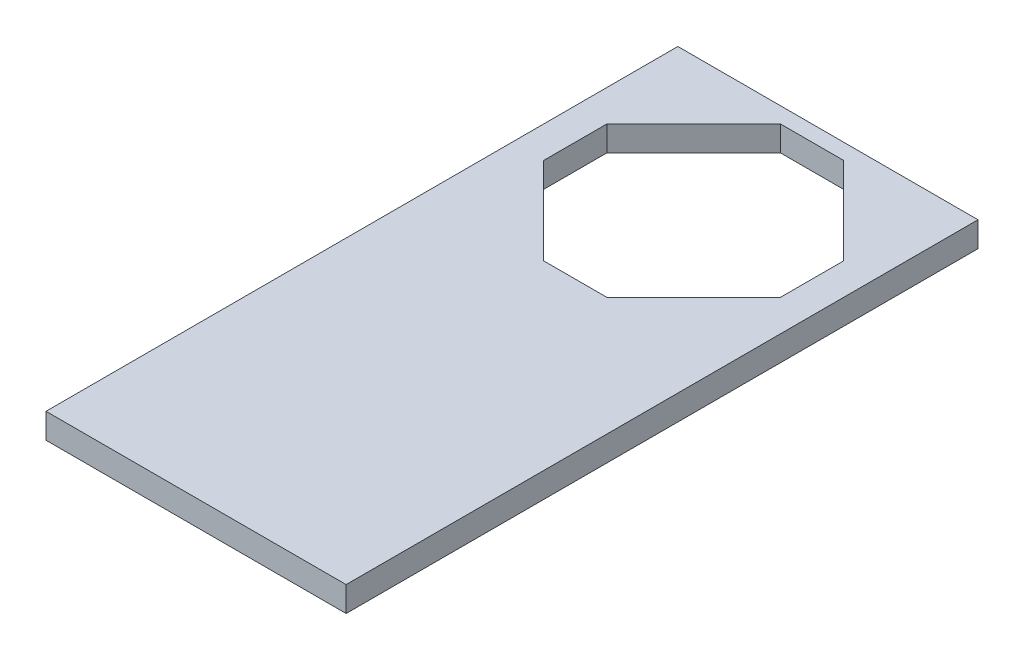
ISO-10303-21;
HEADER;
FILE_DESCRIPTION(('STEP AP214'),'2;1');
FILE_NAME('part.step','',(''),(''),'','','');
FILE_SCHEMA(('AUTOMOTIVE_DESIGN { 1 0 10303 214 1 1 1 1 }'));
ENDSEC;
DATA;
#1=APPLICATION_CONTEXT('core data for automotive mechanical design processes');
#2=APPLICATION_PROTOCOL_DEFINITION('international standard','automotive_design',2000,#1);
#3=PRODUCT_CONTEXT('',#1,'mechanical');
#4=PRODUCT('Part','Part','',(#3));
#5=PRODUCT_RELATED_PRODUCT_CATEGORY('part','',(#4));
#6=PRODUCT_DEFINITION_FORMATION('','',#4);
#7=PRODUCT_DEFINITION_CONTEXT('part definition',#1,'design');
#8=PRODUCT_DEFINITION('design','',#6,#7);
#9=PRODUCT_DEFINITION_SHAPE('','',#8);
#10=(LENGTH_UNIT() NAMED_UNIT(*) SI_UNIT(.MILLI.,.METRE.));
#11=(NAMED_UNIT(*) PLANE_ANGLE_UNIT() SI_UNIT($,.RADIAN.));
#12=(NAMED_UNIT(*) SI_UNIT($,.STERADIAN.) SOLID_ANGLE_UNIT());
#13=UNCERTAINTY_MEASURE_WITH_UNIT(LENGTH_MEASURE(1.E-05),#10,'distance_accuracy_value','');
#14=(GEOMETRIC_REPRESENTATION_CONTEXT(3) GLOBAL_UNCERTAINTY_ASSIGNED_CONTEXT((#13)) GLOBAL_UNIT_ASSIGNED_CONTEXT((#10,
#11,#12)) REPRESENTATION_CONTEXT('',''));
#15=CARTESIAN_POINT('',(0.,0.,0.));
#16=DIRECTION('',(0.,0.,1.));
#17=DIRECTION('',(1.,0.,0.));
#18=AXIS2_PLACEMENT_3D('',#15,#16,#17);
#19=CARTESIAN_POINT('',(0.,0.,40.));
#20=DIRECTION('',(-1.,0.,0.));
#21=DIRECTION('',(0.,0.,1.));
#22=AXIS2_PLACEMENT_3D('',#19,#20,#21);
#23=PLANE('',#22);
#24=DIRECTION('',(0.,1.,0.));
#25=VECTOR('',#24,1.);
#26=CARTESIAN_POINT('',(0.,0.,0.));
#27=LINE('',#26,#25);
#28=CARTESIAN_POINT('',(0.,0.,0.));
#29=VERTEX_POINT('',#28);
#30=CARTESIAN_POINT('',(0.,1.5875,0.));
#31=VERTEX_POINT('',#30);
#32=EDGE_CURVE('E179',#29,#31,#27,.T.);
#33=ORIENTED_EDGE('',*,*,#32,.F.);
#34=DIRECTION('',(0.,0.,-1.));
#35=VECTOR('',#34,1.);
#36=CARTESIAN_POINT('',(0.,0.,40.));
#37=LINE('',#36,#35);
#38=CARTESIAN_POINT('',(0.,0.,40.));
#39=VERTEX_POINT('',#38);
#40=EDGE_CURVE('E11',#39,#29,#37,.T.);
#41=ORIENTED_EDGE('',*,*,#40,.F.);
#42=DIRECTION('',(0.,1.,0.));
#43=VECTOR('',#42,1.);
#44=CARTESIAN_POINT('',(0.,0.,40.));
#45=LINE('',#44,#43);
#46=CARTESIAN_POINT('',(0.,1.5875,40.));
#47=VERTEX_POINT('',#46);
#48=EDGE_CURVE('E191',#39,#47,#45,.T.);
#49=ORIENTED_EDGE('',*,*,#48,.T.);
#50=DIRECTION('',(0.,0.,-1.));
#51=VECTOR('',#50,1.);
#52=CARTESIAN_POINT('',(0.,1.5875,40.));
#53=LINE('',#52,#51);
#54=EDGE_CURVE('E36',#47,#31,#53,.T.);
#55=ORIENTED_EDGE('',*,*,#54,.T.);
#56=EDGE_LOOP('',(#33,#41,#49,#55));
#57=FACE_BOUND('',#56,.T.);
#58=ADVANCED_FACE('F33',(#57),#23,.T.);
#59=CARTESIAN_POINT('',(0.,0.,40.));
#60=DIRECTION('',(0.,1.,0.));
#61=DIRECTION('',(0.,0.,1.));
#62=AXIS2_PLACEMENT_3D('',#59,#60,#61);
#63=PLANE('',#62);
#64=DIRECTION('',(-0.707106781186547,0.,0.707106781186548));
#65=VECTOR('',#64,1.);
#66=CARTESIAN_POINT('',(7.49999999999999,0.,1.));
#67=LINE('',#66,#65);
#68=CARTESIAN_POINT('',(7.49999999999999,0.,1.));
#69=VERTEX_POINT('',#68);
#70=CARTESIAN_POINT('',(2.,0.,6.50000000000001));
#71=VERTEX_POINT('',#70);
#72=EDGE_CURVE('E130',#69,#71,#67,.T.);
#73=ORIENTED_EDGE('',*,*,#72,.T.);
#74=DIRECTION('',(0.,0.,1.));
#75=VECTOR('',#74,1.);
#76=CARTESIAN_POINT('',(2.,0.,6.50000000000001));
#77=LINE('',#76,#75);
#78=CARTESIAN_POINT('',(2.,0.,10.5));
#79=VERTEX_POINT('',#78);
#80=EDGE_CURVE('E124',#71,#79,#77,.T.);
#81=ORIENTED_EDGE('',*,*,#80,.T.);
#82=DIRECTION('',(0.707106781186547,0.,0.707106781186548));
#83=VECTOR('',#82,1.);
#84=CARTESIAN_POINT('',(2.,0.,10.5));
#85=LINE('',#84,#83);
#86=CARTESIAN_POINT('',(7.49999999999997,0.,16.));
#87=VERTEX_POINT('',#86);
#88=EDGE_CURVE('E133',#79,#87,#85,.T.);
#89=ORIENTED_EDGE('',*,*,#88,.T.);
#90=DIRECTION('',(1.,0.,0.));
#91=VECTOR('',#90,1.);
#92=CARTESIAN_POINT('',(7.49999999999997,0.,16.));
#93=LINE('',#92,#91);
#94=CARTESIAN_POINT('',(11.5,0.,16.));
#95=VERTEX_POINT('',#94);
#96=EDGE_CURVE('E49',#87,#95,#93,.T.);
#97=ORIENTED_EDGE('',*,*,#96,.T.);
#98=DIRECTION('',(0.70710678118655,0.,-0.707106781186546));
#99=VECTOR('',#98,1.);
#100=CARTESIAN_POINT('',(11.5,0.,16.));
#101=LINE('',#100,#99);
#102=CARTESIAN_POINT('',(17.,0.,10.5));
#103=VERTEX_POINT('',#102);
#104=EDGE_CURVE('E148',#95,#103,#101,.T.);
#105=ORIENTED_EDGE('',*,*,#104,.T.);
#106=DIRECTION('',(0.,0.,-1.));
#107=VECTOR('',#106,1.);
#108=CARTESIAN_POINT('',(17.,0.,10.5));
#109=LINE('',#108,#107);
#110=CARTESIAN_POINT('',(17.,0.,6.50000000000001));
#111=VERTEX_POINT('',#110);
#112=EDGE_CURVE('E151',#103,#111,#109,.T.);
#113=ORIENTED_EDGE('',*,*,#112,.T.);
#114=DIRECTION('',(-0.707106781186547,0.,-0.707106781186548));
#115=VECTOR('',#114,1.);
#116=CARTESIAN_POINT('',(17.,0.,6.50000000000001));
#117=LINE('',#116,#115);
#118=CARTESIAN_POINT('',(11.5,0.,1.));
#119=VERTEX_POINT('',#118);
#120=EDGE_CURVE('E154',#111,#119,#117,.T.);
#121=ORIENTED_EDGE('',*,*,#120,.T.);
#122=DIRECTION('',(-1.,0.,0.));
#123=VECTOR('',#122,1.);
#124=CARTESIAN_POINT('',(11.5,0.,1.));
#125=LINE('',#124,#123);
#126=EDGE_CURVE('E157',#119,#69,#125,.T.);
#127=ORIENTED_EDGE('',*,*,#126,.T.);
#128=EDGE_LOOP('',(#73,#81,#89,#97,#105,#113,#121,#127));
#129=FACE_BOUND('',#128,.T.);
#130=DIRECTION('',(1.,0.,0.));
#131=VECTOR('',#130,1.);
#132=CARTESIAN_POINT('',(0.,0.,0.));
#133=LINE('',#132,#131);
#134=CARTESIAN_POINT('',(19.,0.,0.));
#135=VERTEX_POINT('',#134);
#136=EDGE_CURVE('E195',#29,#135,#133,.T.);
#137=ORIENTED_EDGE('',*,*,#136,.T.);
#138=DIRECTION('',(0.,0.,-1.));
#139=VECTOR('',#138,1.);
#140=CARTESIAN_POINT('',(19.,0.,40.));
#141=LINE('',#140,#139);
#142=CARTESIAN_POINT('',(19.,0.,40.));
#143=VERTEX_POINT('',#142);
#144=EDGE_CURVE('E41',#143,#135,#141,.T.);
#145=ORIENTED_EDGE('',*,*,#144,.F.);
#146=DIRECTION('',(1.,0.,0.));
#147=VECTOR('',#146,1.);
#148=CARTESIAN_POINT('',(0.,0.,40.));
#149=LINE('',#148,#147);
#150=EDGE_CURVE('E200',#39,#143,#149,.T.);
#151=ORIENTED_EDGE('',*,*,#150,.F.);
#152=ORIENTED_EDGE('',*,*,#40,.T.);
#153=EDGE_LOOP('',(#137,#145,#151,#152));
#154=FACE_BOUND('',#153,.T.);
#155=ADVANCED_FACE('F137',(#129,#154),#63,.F.);
#156=CARTESIAN_POINT('',(19.,0.,40.));
#157=DIRECTION('',(-1.,0.,0.));
#158=DIRECTION('',(0.,0.,1.));
#159=AXIS2_PLACEMENT_3D('',#156,#157,#158);
#160=PLANE('',#159);
#161=DIRECTION('',(0.,1.,0.));
#162=VECTOR('',#161,1.);
#163=CARTESIAN_POINT('',(19.,0.,0.));
#164=LINE('',#163,#162);
#165=CARTESIAN_POINT('',(19.,1.5875,0.));
#166=VERTEX_POINT('',#165);
#167=EDGE_CURVE('E207',#135,#166,#164,.T.);
#168=ORIENTED_EDGE('',*,*,#167,.T.);
#169=DIRECTION('',(0.,0.,-1.));
#170=VECTOR('',#169,1.);
#171=CARTESIAN_POINT('',(19.,1.5875,40.));
#172=LINE('',#171,#170);
#173=CARTESIAN_POINT('',(19.,1.5875,40.));
#174=VERTEX_POINT('',#173);
#175=EDGE_CURVE('E212',#174,#166,#172,.T.);
#176=ORIENTED_EDGE('',*,*,#175,.F.);
#177=DIRECTION('',(0.,1.,0.));
#178=VECTOR('',#177,1.);
#179=CARTESIAN_POINT('',(19.,0.,40.));
#180=LINE('',#179,#178);
#181=EDGE_CURVE('E198',#143,#174,#180,.T.);
#182=ORIENTED_EDGE('',*,*,#181,.F.);
#183=ORIENTED_EDGE('',*,*,#144,.T.);
#184=EDGE_LOOP('',(#168,#176,#182,#183));
#185=FACE_BOUND('',#184,.T.);
#186=ADVANCED_FACE('F229',(#185),#160,.F.);
#187=CARTESIAN_POINT('',(0.,1.5875,40.));
#188=DIRECTION('',(0.,1.,0.));
#189=DIRECTION('',(0.,0.,1.));
#190=AXIS2_PLACEMENT_3D('',#187,#188,#189);
#191=PLANE('',#190);
#192=DIRECTION('',(0.,0.,1.));
#193=VECTOR('',#192,1.);
#194=CARTESIAN_POINT('',(2.,1.5875,6.50000000000001));
#195=LINE('',#194,#193);
#196=CARTESIAN_POINT('',(2.,1.5875,6.50000000000001));
#197=VERTEX_POINT('',#196);
#198=CARTESIAN_POINT('',(2.,1.5875,10.5));
#199=VERTEX_POINT('',#198);
#200=EDGE_CURVE('E57',#197,#199,#195,.T.);
#201=ORIENTED_EDGE('',*,*,#200,.F.);
#202=DIRECTION('',(-0.707106781186547,0.,0.707106781186548));
#203=VECTOR('',#202,1.);
#204=CARTESIAN_POINT('',(7.49999999999999,1.5875,1.));
#205=LINE('',#204,#203);
#206=CARTESIAN_POINT('',(7.49999999999999,1.5875,1.));
#207=VERTEX_POINT('',#206);
#208=EDGE_CURVE('E141',#207,#197,#205,.T.);
#209=ORIENTED_EDGE('',*,*,#208,.F.);
#210=DIRECTION('',(-1.,0.,0.));
#211=VECTOR('',#210,1.);
#212=CARTESIAN_POINT('',(11.5,1.5875,1.));
#213=LINE('',#212,#211);
#214=CARTESIAN_POINT('',(11.5,1.5875,1.));
#215=VERTEX_POINT('',#214);
#216=EDGE_CURVE('E144',#215,#207,#213,.T.);
#217=ORIENTED_EDGE('',*,*,#216,.F.);
#218=DIRECTION('',(-0.707106781186547,0.,-0.707106781186548));
#219=VECTOR('',#218,1.);
#220=CARTESIAN_POINT('',(17.,1.5875,6.50000000000001));
#221=LINE('',#220,#219);
#222=CARTESIAN_POINT('',(17.,1.5875,6.50000000000001));
#223=VERTEX_POINT('',#222);
#224=EDGE_CURVE('E172',#223,#215,#221,.T.);
#225=ORIENTED_EDGE('',*,*,#224,.F.);
#226=DIRECTION('',(0.,0.,-1.));
#227=VECTOR('',#226,1.);
#228=CARTESIAN_POINT('',(17.,1.5875,10.5));
#229=LINE('',#228,#227);
#230=CARTESIAN_POINT('',(17.,1.5875,10.5));
#231=VERTEX_POINT('',#230);
#232=EDGE_CURVE('E169',#231,#223,#229,.T.);
#233=ORIENTED_EDGE('',*,*,#232,.F.);
#234=DIRECTION('',(0.70710678118655,0.,-0.707106781186546));
#235=VECTOR('',#234,1.);
#236=CARTESIAN_POINT('',(11.5,1.5875,16.));
#237=LINE('',#236,#235);
#238=CARTESIAN_POINT('',(11.5,1.5875,16.));
#239=VERTEX_POINT('',#238);
#240=EDGE_CURVE('E166',#239,#231,#237,.T.);
#241=ORIENTED_EDGE('',*,*,#240,.F.);
#242=DIRECTION('',(1.,0.,0.));
#243=VECTOR('',#242,1.);
#244=CARTESIAN_POINT('',(7.49999999999997,1.5875,16.));
#245=LINE('',#244,#243);
#246=CARTESIAN_POINT('',(7.49999999999997,1.5875,16.));
#247=VERTEX_POINT('',#246);
#248=EDGE_CURVE('E163',#247,#239,#245,.T.);
#249=ORIENTED_EDGE('',*,*,#248,.F.);
#250=DIRECTION('',(0.707106781186547,0.,0.707106781186548));
#251=VECTOR('',#250,1.);
#252=CARTESIAN_POINT('',(2.,1.5875,10.5));
#253=LINE('',#252,#251);
#254=EDGE_CURVE('E161',#199,#247,#253,.T.);
#255=ORIENTED_EDGE('',*,*,#254,.F.);
#256=EDGE_LOOP('',(#201,#209,#217,#225,#233,#241,#249,#255));
#257=FACE_BOUND('',#256,.T.);
#258=DIRECTION('',(1.,0.,0.));
#259=VECTOR('',#258,1.);
#260=CARTESIAN_POINT('',(0.,1.5875,0.));
#261=LINE('',#260,#259);
#262=EDGE_CURVE('E204',#31,#166,#261,.T.);
#263=ORIENTED_EDGE('',*,*,#262,.F.);
#264=ORIENTED_EDGE('',*,*,#54,.F.);
#265=DIRECTION('',(1.,0.,0.));
#266=VECTOR('',#265,1.);
#267=CARTESIAN_POINT('',(0.,1.5875,40.));
#268=LINE('',#267,#266);
#269=EDGE_CURVE('E194',#47,#174,#268,.T.);
#270=ORIENTED_EDGE('',*,*,#269,.T.);
#271=ORIENTED_EDGE('',*,*,#175,.T.);
#272=EDGE_LOOP('',(#263,#264,#270,#271));
#273=FACE_BOUND('',#272,.T.);
#274=ADVANCED_FACE('F220',(#257,#273),#191,.T.);
#275=CARTESIAN_POINT('',(0.,0.,40.));
#276=DIRECTION('',(0.,0.,-1.));
#277=DIRECTION('',(-1.,0.,0.));
#278=AXIS2_PLACEMENT_3D('',#275,#276,#277);
#279=PLANE('',#278);
#280=ORIENTED_EDGE('',*,*,#48,.F.);
#281=ORIENTED_EDGE('',*,*,#150,.T.);
#282=ORIENTED_EDGE('',*,*,#181,.T.);
#283=ORIENTED_EDGE('',*,*,#269,.F.);
#284=EDGE_LOOP('',(#280,#281,#282,#283));
#285=FACE_BOUND('',#284,.T.);
#286=ADVANCED_FACE('F231',(#285),#279,.F.);
#287=CARTESIAN_POINT('',(0.,0.,0.));
#288=DIRECTION('',(0.,0.,-1.));
#289=DIRECTION('',(-1.,0.,0.));
#290=AXIS2_PLACEMENT_3D('',#287,#288,#289);
#291=PLANE('',#290);
#292=ORIENTED_EDGE('',*,*,#32,.T.);
#293=ORIENTED_EDGE('',*,*,#262,.T.);
#294=ORIENTED_EDGE('',*,*,#167,.F.);
#295=ORIENTED_EDGE('',*,*,#136,.F.);
#296=EDGE_LOOP('',(#292,#293,#294,#295));
#297=FACE_BOUND('',#296,.T.);
#298=ADVANCED_FACE('F224',(#297),#291,.T.);
#299=CARTESIAN_POINT('',(2.,0.,6.50000000000001));
#300=DIRECTION('',(-1.,0.,0.));
#301=DIRECTION('',(0.,0.,1.));
#302=AXIS2_PLACEMENT_3D('',#299,#300,#301);
#303=PLANE('',#302);
#304=ORIENTED_EDGE('',*,*,#200,.T.);
#305=DIRECTION('',(0.,1.,0.));
#306=VECTOR('',#305,1.);
#307=CARTESIAN_POINT('',(2.,0.,10.5));
#308=LINE('',#307,#306);
#309=EDGE_CURVE('E120',#79,#199,#308,.T.);
#310=ORIENTED_EDGE('',*,*,#309,.F.);
#311=ORIENTED_EDGE('',*,*,#80,.F.);
#312=DIRECTION('',(0.,1.,0.));
#313=VECTOR('',#312,1.);
#314=CARTESIAN_POINT('',(2.,0.,6.50000000000001));
#315=LINE('',#314,#313);
#316=EDGE_CURVE('E177',#71,#197,#315,.T.);
#317=ORIENTED_EDGE('',*,*,#316,.T.);
#318=EDGE_LOOP('',(#304,#310,#311,#317));
#319=FACE_BOUND('',#318,.T.);
#320=ADVANCED_FACE('F122',(#319),#303,.F.);
#321=CARTESIAN_POINT('',(7.49999999999999,0.,1.));
#322=DIRECTION('',(-0.707106781186548,0.,-0.707106781186547));
#323=DIRECTION('',(-0.707106781186547,0.,0.707106781186548));
#324=AXIS2_PLACEMENT_3D('',#321,#322,#323);
#325=PLANE('',#324);
#326=ORIENTED_EDGE('',*,*,#208,.T.);
#327=ORIENTED_EDGE('',*,*,#316,.F.);
#328=ORIENTED_EDGE('',*,*,#72,.F.);
#329=DIRECTION('',(0.,1.,0.));
#330=VECTOR('',#329,1.);
#331=CARTESIAN_POINT('',(7.49999999999999,0.,1.));
#332=LINE('',#331,#330);
#333=EDGE_CURVE('E180',#69,#207,#332,.T.);
#334=ORIENTED_EDGE('',*,*,#333,.T.);
#335=EDGE_LOOP('',(#326,#327,#328,#334));
#336=FACE_BOUND('',#335,.T.);
#337=ADVANCED_FACE('F269',(#336),#325,.F.);
#338=CARTESIAN_POINT('',(11.5,0.,1.));
#339=DIRECTION('',(0.,0.,-1.));
#340=DIRECTION('',(-1.,0.,0.));
#341=AXIS2_PLACEMENT_3D('',#338,#339,#340);
#342=PLANE('',#341);
#343=ORIENTED_EDGE('',*,*,#216,.T.);
#344=ORIENTED_EDGE('',*,*,#333,.F.);
#345=ORIENTED_EDGE('',*,*,#126,.F.);
#346=DIRECTION('',(0.,1.,0.));
#347=VECTOR('',#346,1.);
#348=CARTESIAN_POINT('',(11.5,0.,1.));
#349=LINE('',#348,#347);
#350=EDGE_CURVE('E182',#119,#215,#349,.T.);
#351=ORIENTED_EDGE('',*,*,#350,.T.);
#352=EDGE_LOOP('',(#343,#344,#345,#351));
#353=FACE_BOUND('',#352,.T.);
#354=ADVANCED_FACE('F278',(#353),#342,.F.);
#355=CARTESIAN_POINT('',(17.,0.,6.50000000000001));
#356=DIRECTION('',(0.707106781186548,0.,-0.707106781186547));
#357=DIRECTION('',(-0.707106781186547,0.,-0.707106781186548));
#358=AXIS2_PLACEMENT_3D('',#355,#356,#357);
#359=PLANE('',#358);
#360=ORIENTED_EDGE('',*,*,#224,.T.);
#361=ORIENTED_EDGE('',*,*,#350,.F.);
#362=ORIENTED_EDGE('',*,*,#120,.F.);
#363=DIRECTION('',(0.,1.,0.));
#364=VECTOR('',#363,1.);
#365=CARTESIAN_POINT('',(17.,0.,6.50000000000001));
#366=LINE('',#365,#364);
#367=EDGE_CURVE('E184',#111,#223,#366,.T.);
#368=ORIENTED_EDGE('',*,*,#367,.T.);
#369=EDGE_LOOP('',(#360,#361,#362,#368));
#370=FACE_BOUND('',#369,.T.);
#371=ADVANCED_FACE('F288',(#370),#359,.F.);
#372=CARTESIAN_POINT('',(17.,0.,10.5));
#373=DIRECTION('',(1.,0.,0.));
#374=DIRECTION('',(0.,0.,-1.));
#375=AXIS2_PLACEMENT_3D('',#372,#373,#374);
#376=PLANE('',#375);
#377=ORIENTED_EDGE('',*,*,#232,.T.);
#378=ORIENTED_EDGE('',*,*,#367,.F.);
#379=ORIENTED_EDGE('',*,*,#112,.F.);
#380=DIRECTION('',(0.,1.,0.));
#381=VECTOR('',#380,1.);
#382=CARTESIAN_POINT('',(17.,0.,10.5));
#383=LINE('',#382,#381);
#384=EDGE_CURVE('E186',#103,#231,#383,.T.);
#385=ORIENTED_EDGE('',*,*,#384,.T.);
#386=EDGE_LOOP('',(#377,#378,#379,#385));
#387=FACE_BOUND('',#386,.T.);
#388=ADVANCED_FACE('F298',(#387),#376,.F.);
#389=CARTESIAN_POINT('',(11.5,0.,16.));
#390=DIRECTION('',(0.707106781186545,0.,0.707106781186549));
#391=DIRECTION('',(0.70710678118655,0.,-0.707106781186545));
#392=AXIS2_PLACEMENT_3D('',#389,#390,#391);
#393=PLANE('',#392);
#394=ORIENTED_EDGE('',*,*,#240,.T.);
#395=ORIENTED_EDGE('',*,*,#384,.F.);
#396=ORIENTED_EDGE('',*,*,#104,.F.);
#397=DIRECTION('',(0.,1.,0.));
#398=VECTOR('',#397,1.);
#399=CARTESIAN_POINT('',(11.5,0.,16.));
#400=LINE('',#399,#398);
#401=EDGE_CURVE('E188',#95,#239,#400,.T.);
#402=ORIENTED_EDGE('',*,*,#401,.T.);
#403=EDGE_LOOP('',(#394,#395,#396,#402));
#404=FACE_BOUND('',#403,.T.);
#405=ADVANCED_FACE('F308',(#404),#393,.F.);
#406=CARTESIAN_POINT('',(7.49999999999997,0.,16.));
#407=DIRECTION('',(0.,0.,1.));
#408=DIRECTION('',(1.,0.,0.));
#409=AXIS2_PLACEMENT_3D('',#406,#407,#408);
#410=PLANE('',#409);
#411=ORIENTED_EDGE('',*,*,#248,.T.);
#412=ORIENTED_EDGE('',*,*,#401,.F.);
#413=ORIENTED_EDGE('',*,*,#96,.F.);
#414=DIRECTION('',(0.,1.,0.));
#415=VECTOR('',#414,1.);
#416=CARTESIAN_POINT('',(7.49999999999997,0.,16.));
#417=LINE('',#416,#415);
#418=EDGE_CURVE('E129',#87,#247,#417,.T.);
#419=ORIENTED_EDGE('',*,*,#418,.T.);
#420=EDGE_LOOP('',(#411,#412,#413,#419));
#421=FACE_BOUND('',#420,.T.);
#422=ADVANCED_FACE('F318',(#421),#410,.F.);
#423=CARTESIAN_POINT('',(2.,0.,10.5));
#424=DIRECTION('',(-0.707106781186548,0.,0.707106781186547));
#425=DIRECTION('',(0.707106781186547,0.,0.707106781186548));
#426=AXIS2_PLACEMENT_3D('',#423,#424,#425);
#427=PLANE('',#426);
#428=ORIENTED_EDGE('',*,*,#254,.T.);
#429=ORIENTED_EDGE('',*,*,#418,.F.);
#430=ORIENTED_EDGE('',*,*,#88,.F.);
#431=ORIENTED_EDGE('',*,*,#309,.T.);
#432=EDGE_LOOP('',(#428,#429,#430,#431));
#433=FACE_BOUND('',#432,.T.);
#434=ADVANCED_FACE('F134',(#433),#427,.F.);
#435=CLOSED_SHELL('',(#58,#155,#186,#274,#286,#298,#320,#337,#354,#371,#388,#405,#422,#434));
#436=MANIFOLD_SOLID_BREP('B2',#435);
#437=ADVANCED_BREP_SHAPE_REPRESENTATION('',(#18,#436),#14);
#438=SHAPE_DEFINITION_REPRESENTATION(#9,#437);
ENDSEC;
END-ISO-10303-21;
